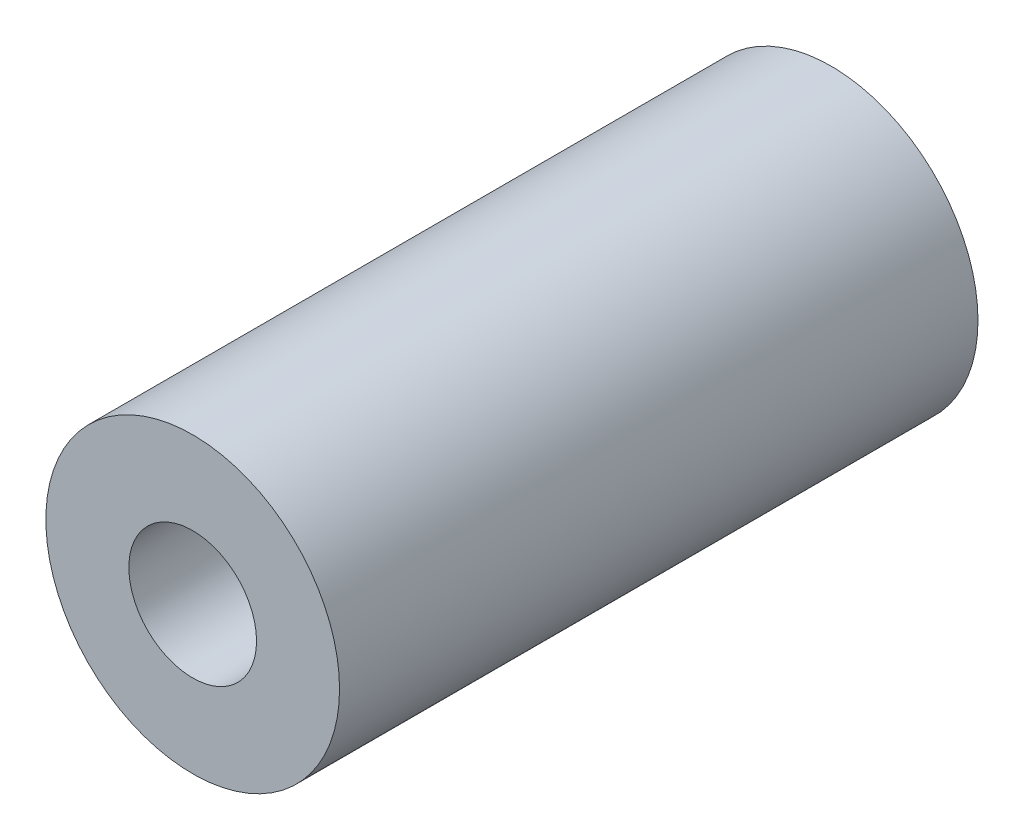
ISO-10303-21;
HEADER;
FILE_DESCRIPTION(('STEP AP214'),'2;1');
FILE_NAME('part.step','',(''),(''),'','','');
FILE_SCHEMA(('AUTOMOTIVE_DESIGN { 1 0 10303 214 1 1 1 1 }'));
ENDSEC;
DATA;
#1=APPLICATION_CONTEXT('core data for automotive mechanical design processes');
#2=APPLICATION_PROTOCOL_DEFINITION('international standard','automotive_design',2000,#1);
#3=PRODUCT_CONTEXT('',#1,'mechanical');
#4=PRODUCT('Part','Part','',(#3));
#5=PRODUCT_RELATED_PRODUCT_CATEGORY('part','',(#4));
#6=PRODUCT_DEFINITION_FORMATION('','',#4);
#7=PRODUCT_DEFINITION_CONTEXT('part definition',#1,'design');
#8=PRODUCT_DEFINITION('design','',#6,#7);
#9=PRODUCT_DEFINITION_SHAPE('','',#8);
#10=(LENGTH_UNIT() NAMED_UNIT(*) SI_UNIT(.MILLI.,.METRE.));
#11=(NAMED_UNIT(*) PLANE_ANGLE_UNIT() SI_UNIT($,.RADIAN.));
#12=(NAMED_UNIT(*) SI_UNIT($,.STERADIAN.) SOLID_ANGLE_UNIT());
#13=UNCERTAINTY_MEASURE_WITH_UNIT(LENGTH_MEASURE(1.E-05),#10,'distance_accuracy_value','');
#14=(GEOMETRIC_REPRESENTATION_CONTEXT(3) GLOBAL_UNCERTAINTY_ASSIGNED_CONTEXT((#13)) GLOBAL_UNIT_ASSIGNED_CONTEXT((#10,
#11,#12)) REPRESENTATION_CONTEXT('',''));
#15=CARTESIAN_POINT('',(0.,0.,0.));
#16=DIRECTION('',(0.,0.,1.));
#17=DIRECTION('',(1.,0.,0.));
#18=AXIS2_PLACEMENT_3D('',#15,#16,#17);
#19=CARTESIAN_POINT('',(0.,0.,10.));
#20=DIRECTION('',(0.,0.,1.));
#21=DIRECTION('',(1.,0.,0.));
#22=AXIS2_PLACEMENT_3D('',#19,#20,#21);
#23=PLANE('',#22);
#24=CARTESIAN_POINT('',(0.,0.,10.));
#25=DIRECTION('',(0.,0.,1.));
#26=DIRECTION('',(1.,0.,0.));
#27=AXIS2_PLACEMENT_3D('',#24,#25,#26);
#28=CIRCLE('',#27,2.3);
#29=CARTESIAN_POINT('',(2.3,0.,10.));
#30=VERTEX_POINT('',#29);
#31=EDGE_CURVE('E10',#30,#30,#28,.T.);
#32=ORIENTED_EDGE('',*,*,#31,.T.);
#33=EDGE_LOOP('',(#32));
#34=FACE_BOUND('',#33,.T.);
#35=CARTESIAN_POINT('',(0.,0.,10.));
#36=DIRECTION('',(0.,0.,1.));
#37=DIRECTION('',(1.,0.,0.));
#38=AXIS2_PLACEMENT_3D('',#35,#36,#37);
#39=CIRCLE('',#38,1.);
#40=CARTESIAN_POINT('',(1.,0.,10.));
#41=VERTEX_POINT('',#40);
#42=EDGE_CURVE('E42',#41,#41,#39,.T.);
#43=ORIENTED_EDGE('',*,*,#42,.F.);
#44=EDGE_LOOP('',(#43));
#45=FACE_BOUND('',#44,.T.);
#46=ADVANCED_FACE('F31',(#34,#45),#23,.T.);
#47=CARTESIAN_POINT('',(0.,0.,0.));
#48=DIRECTION('',(0.,0.,1.));
#49=DIRECTION('',(1.,0.,0.));
#50=AXIS2_PLACEMENT_3D('',#47,#48,#49);
#51=PLANE('',#50);
#52=CARTESIAN_POINT('',(0.,0.,0.));
#53=DIRECTION('',(0.,0.,1.));
#54=DIRECTION('',(1.,0.,0.));
#55=AXIS2_PLACEMENT_3D('',#52,#53,#54);
#56=CIRCLE('',#55,2.3);
#57=CARTESIAN_POINT('',(2.3,0.,0.));
#58=VERTEX_POINT('',#57);
#59=EDGE_CURVE('E35',#58,#58,#56,.T.);
#60=ORIENTED_EDGE('',*,*,#59,.F.);
#61=EDGE_LOOP('',(#60));
#62=FACE_BOUND('',#61,.T.);
#63=CARTESIAN_POINT('',(0.,0.,0.));
#64=DIRECTION('',(0.,0.,1.));
#65=DIRECTION('',(1.,0.,0.));
#66=AXIS2_PLACEMENT_3D('',#63,#64,#65);
#67=CIRCLE('',#66,1.);
#68=CARTESIAN_POINT('',(1.,0.,0.));
#69=VERTEX_POINT('',#68);
#70=EDGE_CURVE('E44',#69,#69,#67,.T.);
#71=ORIENTED_EDGE('',*,*,#70,.T.);
#72=EDGE_LOOP('',(#71));
#73=FACE_BOUND('',#72,.T.);
#74=ADVANCED_FACE('F54',(#62,#73),#51,.F.);
#75=CARTESIAN_POINT('',(0.,0.,10.));
#76=DIRECTION('',(0.,0.,-1.));
#77=DIRECTION('',(-1.,0.,0.));
#78=AXIS2_PLACEMENT_3D('',#75,#76,#77);
#79=CYLINDRICAL_SURFACE('',#78,2.3);
#80=ORIENTED_EDGE('',*,*,#31,.F.);
#81=EDGE_LOOP('',(#80));
#82=FACE_BOUND('',#81,.T.);
#83=ORIENTED_EDGE('',*,*,#59,.T.);
#84=EDGE_LOOP('',(#83));
#85=FACE_BOUND('',#84,.T.);
#86=ADVANCED_FACE('F33',(#82,#85),#79,.T.);
#87=CARTESIAN_POINT('',(0.,0.,10.));
#88=DIRECTION('',(0.,0.,-1.));
#89=DIRECTION('',(-1.,0.,0.));
#90=AXIS2_PLACEMENT_3D('',#87,#88,#89);
#91=CYLINDRICAL_SURFACE('',#90,1.);
#92=ORIENTED_EDGE('',*,*,#42,.T.);
#93=EDGE_LOOP('',(#92));
#94=FACE_BOUND('',#93,.T.);
#95=ORIENTED_EDGE('',*,*,#70,.F.);
#96=EDGE_LOOP('',(#95));
#97=FACE_BOUND('',#96,.T.);
#98=ADVANCED_FACE('F50',(#94,#97),#91,.F.);
#99=CLOSED_SHELL('',(#46,#74,#86,#98));
#100=MANIFOLD_SOLID_BREP('B2',#99);
#101=ADVANCED_BREP_SHAPE_REPRESENTATION('',(#18,#100),#14);
#102=SHAPE_DEFINITION_REPRESENTATION(#9,#101);
ENDSEC;
END-ISO-10303-21;
